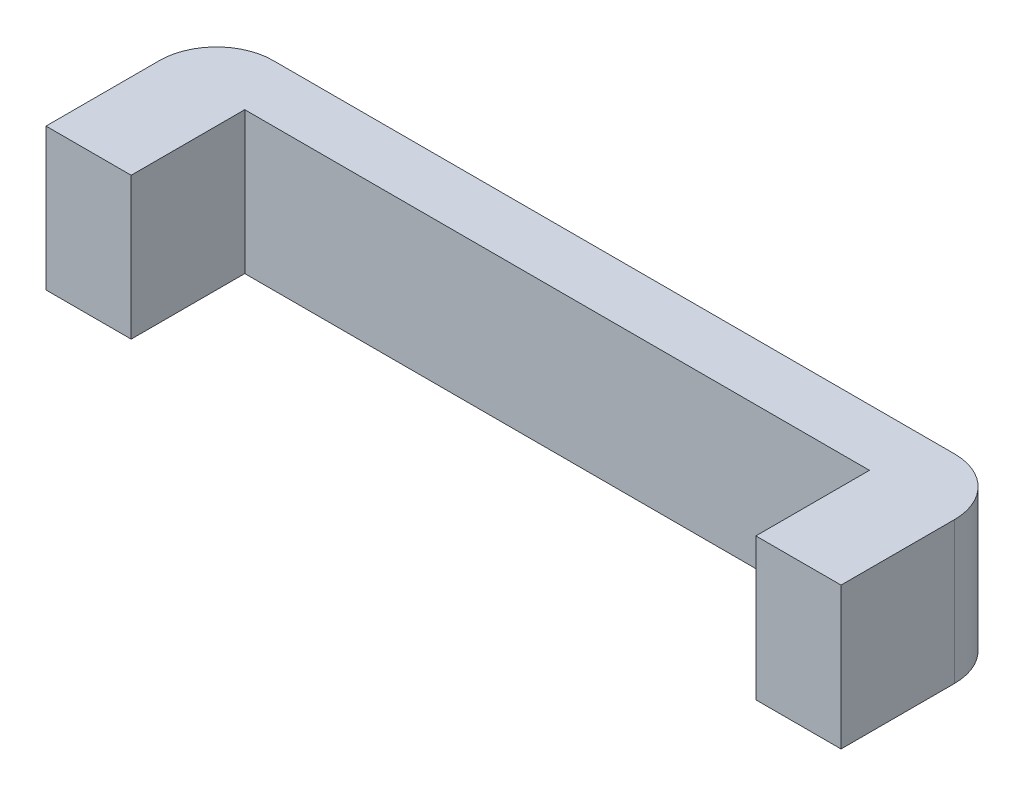
ISO-10303-21;
HEADER;
FILE_DESCRIPTION(('STEP AP214'),'2;1');
FILE_NAME('part.step','',(''),(''),'','','');
FILE_SCHEMA(('AUTOMOTIVE_DESIGN { 1 0 10303 214 1 1 1 1 }'));
ENDSEC;
DATA;
#1=APPLICATION_CONTEXT('core data for automotive mechanical design processes');
#2=APPLICATION_PROTOCOL_DEFINITION('international standard','automotive_design',2000,#1);
#3=PRODUCT_CONTEXT('',#1,'mechanical');
#4=PRODUCT('Part','Part','',(#3));
#5=PRODUCT_RELATED_PRODUCT_CATEGORY('part','',(#4));
#6=PRODUCT_DEFINITION_FORMATION('','',#4);
#7=PRODUCT_DEFINITION_CONTEXT('part definition',#1,'design');
#8=PRODUCT_DEFINITION('design','',#6,#7);
#9=PRODUCT_DEFINITION_SHAPE('','',#8);
#10=(LENGTH_UNIT() NAMED_UNIT(*) SI_UNIT(.MILLI.,.METRE.));
#11=(NAMED_UNIT(*) PLANE_ANGLE_UNIT() SI_UNIT($,.RADIAN.));
#12=(NAMED_UNIT(*) SI_UNIT($,.STERADIAN.) SOLID_ANGLE_UNIT());
#13=UNCERTAINTY_MEASURE_WITH_UNIT(LENGTH_MEASURE(1.E-05),#10,'distance_accuracy_value','');
#14=(GEOMETRIC_REPRESENTATION_CONTEXT(3) GLOBAL_UNCERTAINTY_ASSIGNED_CONTEXT((#13)) GLOBAL_UNIT_ASSIGNED_CONTEXT((#10,
#11,#12)) REPRESENTATION_CONTEXT('',''));
#15=CARTESIAN_POINT('',(0.,0.,0.));
#16=DIRECTION('',(0.,0.,1.));
#17=DIRECTION('',(1.,0.,0.));
#18=AXIS2_PLACEMENT_3D('',#15,#16,#17);
#19=CARTESIAN_POINT('',(0.,6.35,7.62));
#20=DIRECTION('',(0.,0.,-1.));
#21=DIRECTION('',(-1.,0.,0.));
#22=AXIS2_PLACEMENT_3D('',#19,#20,#21);
#23=PLANE('',#22);
#24=DIRECTION('',(1.,0.,0.));
#25=VECTOR('',#24,1.);
#26=CARTESIAN_POINT('',(0.,0.,7.62));
#27=LINE('',#26,#25);
#28=CARTESIAN_POINT('',(0.,0.,7.62));
#29=VERTEX_POINT('',#28);
#30=CARTESIAN_POINT('',(3.81,0.,7.62));
#31=VERTEX_POINT('',#30);
#32=EDGE_CURVE('E130',#29,#31,#27,.T.);
#33=ORIENTED_EDGE('',*,*,#32,.T.);
#34=DIRECTION('',(0.,1.,0.));
#35=VECTOR('',#34,1.);
#36=CARTESIAN_POINT('',(3.81,0.,7.62));
#37=LINE('',#36,#35);
#38=CARTESIAN_POINT('',(3.81,6.35,7.62));
#39=VERTEX_POINT('',#38);
#40=EDGE_CURVE('E112',#31,#39,#37,.T.);
#41=ORIENTED_EDGE('',*,*,#40,.T.);
#42=DIRECTION('',(1.,0.,0.));
#43=VECTOR('',#42,1.);
#44=CARTESIAN_POINT('',(0.,6.35,7.62));
#45=LINE('',#44,#43);
#46=CARTESIAN_POINT('',(0.,6.35,7.62));
#47=VERTEX_POINT('',#46);
#48=EDGE_CURVE('E207',#47,#39,#45,.T.);
#49=ORIENTED_EDGE('',*,*,#48,.F.);
#50=DIRECTION('',(0.,-1.,0.));
#51=VECTOR('',#50,1.);
#52=CARTESIAN_POINT('',(0.,6.35,7.62));
#53=LINE('',#52,#51);
#54=EDGE_CURVE('E137',#47,#29,#53,.T.);
#55=ORIENTED_EDGE('',*,*,#54,.T.);
#56=EDGE_LOOP('',(#33,#41,#49,#55));
#57=FACE_BOUND('',#56,.T.);
#58=ADVANCED_FACE('F33',(#57),#23,.F.);
#59=CARTESIAN_POINT('',(0.,6.35,0.));
#60=DIRECTION('',(1.,0.,0.));
#61=DIRECTION('',(0.,0.,-1.));
#62=AXIS2_PLACEMENT_3D('',#59,#60,#61);
#63=PLANE('',#62);
#64=DIRECTION('',(0.,0.,1.));
#65=VECTOR('',#64,1.);
#66=CARTESIAN_POINT('',(0.,6.35,0.));
#67=LINE('',#66,#65);
#68=CARTESIAN_POINT('',(0.,6.35,2.54));
#69=VERTEX_POINT('',#68);
#70=EDGE_CURVE('E148',#69,#47,#67,.T.);
#71=ORIENTED_EDGE('',*,*,#70,.F.);
#72=DIRECTION('',(0.,-1.,0.));
#73=VECTOR('',#72,1.);
#74=CARTESIAN_POINT('',(0.,6.35,2.54));
#75=LINE('',#74,#73);
#76=CARTESIAN_POINT('',(0.,0.,2.54));
#77=VERTEX_POINT('',#76);
#78=EDGE_CURVE('E154',#69,#77,#75,.T.);
#79=ORIENTED_EDGE('',*,*,#78,.T.);
#80=DIRECTION('',(0.,0.,1.));
#81=VECTOR('',#80,1.);
#82=CARTESIAN_POINT('',(0.,0.,0.));
#83=LINE('',#82,#81);
#84=EDGE_CURVE('E143',#77,#29,#83,.T.);
#85=ORIENTED_EDGE('',*,*,#84,.T.);
#86=ORIENTED_EDGE('',*,*,#54,.F.);
#87=EDGE_LOOP('',(#71,#79,#85,#86));
#88=FACE_BOUND('',#87,.T.);
#89=ADVANCED_FACE('F173',(#88),#63,.F.);
#90=CARTESIAN_POINT('',(31.75,6.35,7.62));
#91=VERTEX_POINT('',#90);
#92=CARTESIAN_POINT('',(35.56,6.35,7.62));
#93=VERTEX_POINT('',#92);
#94=EDGE_CURVE('E174',#91,#93,#45,.T.);
#95=ORIENTED_EDGE('',*,*,#94,.F.);
#96=DIRECTION('',(0.,1.,0.));
#97=VECTOR('',#96,1.);
#98=CARTESIAN_POINT('',(31.75,0.,7.62));
#99=LINE('',#98,#97);
#100=CARTESIAN_POINT('',(31.75,0.,7.62));
#101=VERTEX_POINT('',#100);
#102=EDGE_CURVE('E123',#101,#91,#99,.T.);
#103=ORIENTED_EDGE('',*,*,#102,.F.);
#104=CARTESIAN_POINT('',(35.56,0.,7.62));
#105=VERTEX_POINT('',#104);
#106=EDGE_CURVE('E139',#101,#105,#27,.T.);
#107=ORIENTED_EDGE('',*,*,#106,.T.);
#108=DIRECTION('',(0.,-1.,0.));
#109=VECTOR('',#108,1.);
#110=CARTESIAN_POINT('',(35.56,6.35,7.62));
#111=LINE('',#110,#109);
#112=EDGE_CURVE('E149',#93,#105,#111,.T.);
#113=ORIENTED_EDGE('',*,*,#112,.F.);
#114=EDGE_LOOP('',(#95,#103,#107,#113));
#115=FACE_BOUND('',#114,.T.);
#116=ADVANCED_FACE('F189',(#115),#23,.F.);
#117=CARTESIAN_POINT('',(35.56,6.35,0.));
#118=DIRECTION('',(-1.,0.,0.));
#119=DIRECTION('',(0.,0.,1.));
#120=AXIS2_PLACEMENT_3D('',#117,#118,#119);
#121=PLANE('',#120);
#122=DIRECTION('',(0.,0.,-1.));
#123=VECTOR('',#122,1.);
#124=CARTESIAN_POINT('',(35.56,0.,0.));
#125=LINE('',#124,#123);
#126=CARTESIAN_POINT('',(35.56,0.,2.54));
#127=VERTEX_POINT('',#126);
#128=EDGE_CURVE('E138',#105,#127,#125,.T.);
#129=ORIENTED_EDGE('',*,*,#128,.T.);
#130=DIRECTION('',(0.,-1.,0.));
#131=VECTOR('',#130,1.);
#132=CARTESIAN_POINT('',(35.56,6.35,2.54));
#133=LINE('',#132,#131);
#134=CARTESIAN_POINT('',(35.56,6.35,2.54));
#135=VERTEX_POINT('',#134);
#136=EDGE_CURVE('E11',#127,#135,#133,.F.);
#137=ORIENTED_EDGE('',*,*,#136,.T.);
#138=DIRECTION('',(0.,0.,-1.));
#139=VECTOR('',#138,1.);
#140=CARTESIAN_POINT('',(35.56,6.35,0.));
#141=LINE('',#140,#139);
#142=EDGE_CURVE('E186',#93,#135,#141,.T.);
#143=ORIENTED_EDGE('',*,*,#142,.F.);
#144=ORIENTED_EDGE('',*,*,#112,.T.);
#145=EDGE_LOOP('',(#129,#137,#143,#144));
#146=FACE_BOUND('',#145,.T.);
#147=ADVANCED_FACE('F184',(#146),#121,.F.);
#148=CARTESIAN_POINT('',(0.,6.35,0.));
#149=DIRECTION('',(0.,0.,1.));
#150=DIRECTION('',(1.,0.,0.));
#151=AXIS2_PLACEMENT_3D('',#148,#149,#150);
#152=PLANE('',#151);
#153=DIRECTION('',(-1.,0.,0.));
#154=VECTOR('',#153,1.);
#155=CARTESIAN_POINT('',(0.,0.,0.));
#156=LINE('',#155,#154);
#157=CARTESIAN_POINT('',(33.02,0.,0.));
#158=VERTEX_POINT('',#157);
#159=CARTESIAN_POINT('',(2.54,0.,0.));
#160=VERTEX_POINT('',#159);
#161=EDGE_CURVE('E141',#158,#160,#156,.T.);
#162=ORIENTED_EDGE('',*,*,#161,.T.);
#163=DIRECTION('',(0.,-1.,0.));
#164=VECTOR('',#163,1.);
#165=CARTESIAN_POINT('',(2.54,6.35,0.));
#166=LINE('',#165,#164);
#167=CARTESIAN_POINT('',(2.54,6.35,0.));
#168=VERTEX_POINT('',#167);
#169=EDGE_CURVE('E54',#160,#168,#166,.F.);
#170=ORIENTED_EDGE('',*,*,#169,.T.);
#171=DIRECTION('',(-1.,0.,0.));
#172=VECTOR('',#171,1.);
#173=CARTESIAN_POINT('',(0.,6.35,0.));
#174=LINE('',#173,#172);
#175=CARTESIAN_POINT('',(33.02,6.35,0.));
#176=VERTEX_POINT('',#175);
#177=EDGE_CURVE('E152',#176,#168,#174,.T.);
#178=ORIENTED_EDGE('',*,*,#177,.F.);
#179=DIRECTION('',(0.,-1.,0.));
#180=VECTOR('',#179,1.);
#181=CARTESIAN_POINT('',(33.02,6.35,0.));
#182=LINE('',#181,#180);
#183=EDGE_CURVE('E161',#176,#158,#182,.T.);
#184=ORIENTED_EDGE('',*,*,#183,.T.);
#185=EDGE_LOOP('',(#162,#170,#178,#184));
#186=FACE_BOUND('',#185,.T.);
#187=ADVANCED_FACE('F178',(#186),#152,.F.);
#188=CARTESIAN_POINT('',(0.,6.35,0.));
#189=DIRECTION('',(0.,1.,0.));
#190=DIRECTION('',(0.,0.,1.));
#191=AXIS2_PLACEMENT_3D('',#188,#189,#190);
#192=PLANE('',#191);
#193=ORIENTED_EDGE('',*,*,#177,.T.);
#194=CARTESIAN_POINT('',(2.54,6.35,2.54));
#195=DIRECTION('',(0.,1.,0.));
#196=DIRECTION('',(0.,0.,1.));
#197=AXIS2_PLACEMENT_3D('',#194,#195,#196);
#198=CIRCLE('',#197,2.54);
#199=EDGE_CURVE('E41',#168,#69,#198,.T.);
#200=ORIENTED_EDGE('',*,*,#199,.T.);
#201=ORIENTED_EDGE('',*,*,#70,.T.);
#202=ORIENTED_EDGE('',*,*,#48,.T.);
#203=DIRECTION('',(0.,0.,1.));
#204=VECTOR('',#203,1.);
#205=CARTESIAN_POINT('',(3.81,6.35,7.62));
#206=LINE('',#205,#204);
#207=CARTESIAN_POINT('',(3.81,6.35,2.54));
#208=VERTEX_POINT('',#207);
#209=EDGE_CURVE('E118',#208,#39,#206,.T.);
#210=ORIENTED_EDGE('',*,*,#209,.F.);
#211=DIRECTION('',(-1.,0.,0.));
#212=VECTOR('',#211,1.);
#213=CARTESIAN_POINT('',(3.81,6.35,2.54));
#214=LINE('',#213,#212);
#215=CARTESIAN_POINT('',(31.75,6.35,2.54));
#216=VERTEX_POINT('',#215);
#217=EDGE_CURVE('E134',#216,#208,#214,.T.);
#218=ORIENTED_EDGE('',*,*,#217,.F.);
#219=DIRECTION('',(0.,0.,-1.));
#220=VECTOR('',#219,1.);
#221=CARTESIAN_POINT('',(31.75,6.35,7.62));
#222=LINE('',#221,#220);
#223=EDGE_CURVE('E197',#91,#216,#222,.T.);
#224=ORIENTED_EDGE('',*,*,#223,.F.);
#225=ORIENTED_EDGE('',*,*,#94,.T.);
#226=ORIENTED_EDGE('',*,*,#142,.T.);
#227=CARTESIAN_POINT('',(33.02,6.35,2.54));
#228=DIRECTION('',(0.,1.,0.));
#229=DIRECTION('',(0.,0.,1.));
#230=AXIS2_PLACEMENT_3D('',#227,#228,#229);
#231=CIRCLE('',#230,2.54);
#232=EDGE_CURVE('E165',#135,#176,#231,.T.);
#233=ORIENTED_EDGE('',*,*,#232,.T.);
#234=EDGE_LOOP('',(#193,#200,#201,#202,#210,#218,#224,#225,#226,#233));
#235=FACE_BOUND('',#234,.T.);
#236=ADVANCED_FACE('F169',(#235),#192,.T.);
#237=CARTESIAN_POINT('',(0.,0.,0.));
#238=DIRECTION('',(0.,1.,0.));
#239=DIRECTION('',(0.,0.,1.));
#240=AXIS2_PLACEMENT_3D('',#237,#238,#239);
#241=PLANE('',#240);
#242=ORIENTED_EDGE('',*,*,#84,.F.);
#243=CARTESIAN_POINT('',(2.54,0.,2.54));
#244=DIRECTION('',(0.,1.,0.));
#245=DIRECTION('',(0.,0.,1.));
#246=AXIS2_PLACEMENT_3D('',#243,#244,#245);
#247=CIRCLE('',#246,2.54);
#248=EDGE_CURVE('E159',#77,#160,#247,.F.);
#249=ORIENTED_EDGE('',*,*,#248,.T.);
#250=ORIENTED_EDGE('',*,*,#161,.F.);
#251=CARTESIAN_POINT('',(33.02,0.,2.54));
#252=DIRECTION('',(0.,1.,0.));
#253=DIRECTION('',(0.,0.,1.));
#254=AXIS2_PLACEMENT_3D('',#251,#252,#253);
#255=CIRCLE('',#254,2.54);
#256=EDGE_CURVE('E157',#158,#127,#255,.F.);
#257=ORIENTED_EDGE('',*,*,#256,.T.);
#258=ORIENTED_EDGE('',*,*,#128,.F.);
#259=ORIENTED_EDGE('',*,*,#106,.F.);
#260=DIRECTION('',(0.,0.,-1.));
#261=VECTOR('',#260,1.);
#262=CARTESIAN_POINT('',(31.75,0.,7.62));
#263=LINE('',#262,#261);
#264=CARTESIAN_POINT('',(31.75,0.,2.54));
#265=VERTEX_POINT('',#264);
#266=EDGE_CURVE('E133',#101,#265,#263,.T.);
#267=ORIENTED_EDGE('',*,*,#266,.T.);
#268=DIRECTION('',(-1.,0.,0.));
#269=VECTOR('',#268,1.);
#270=CARTESIAN_POINT('',(3.81,0.,2.54));
#271=LINE('',#270,#269);
#272=CARTESIAN_POINT('',(3.81,0.,2.54));
#273=VERTEX_POINT('',#272);
#274=EDGE_CURVE('E124',#265,#273,#271,.T.);
#275=ORIENTED_EDGE('',*,*,#274,.T.);
#276=DIRECTION('',(0.,0.,1.));
#277=VECTOR('',#276,1.);
#278=CARTESIAN_POINT('',(3.81,0.,7.62));
#279=LINE('',#278,#277);
#280=EDGE_CURVE('E115',#273,#31,#279,.T.);
#281=ORIENTED_EDGE('',*,*,#280,.T.);
#282=ORIENTED_EDGE('',*,*,#32,.F.);
#283=EDGE_LOOP('',(#242,#249,#250,#257,#258,#259,#267,#275,#281,#282));
#284=FACE_BOUND('',#283,.T.);
#285=ADVANCED_FACE('F129',(#284),#241,.F.);
#286=CARTESIAN_POINT('',(3.81,0.,7.62));
#287=DIRECTION('',(-1.,0.,0.));
#288=DIRECTION('',(0.,0.,1.));
#289=AXIS2_PLACEMENT_3D('',#286,#287,#288);
#290=PLANE('',#289);
#291=ORIENTED_EDGE('',*,*,#209,.T.);
#292=ORIENTED_EDGE('',*,*,#40,.F.);
#293=ORIENTED_EDGE('',*,*,#280,.F.);
#294=DIRECTION('',(0.,1.,0.));
#295=VECTOR('',#294,1.);
#296=CARTESIAN_POINT('',(3.81,0.,2.54));
#297=LINE('',#296,#295);
#298=EDGE_CURVE('E202',#273,#208,#297,.T.);
#299=ORIENTED_EDGE('',*,*,#298,.T.);
#300=EDGE_LOOP('',(#291,#292,#293,#299));
#301=FACE_BOUND('',#300,.T.);
#302=ADVANCED_FACE('F114',(#301),#290,.F.);
#303=CARTESIAN_POINT('',(3.81,0.,2.54));
#304=DIRECTION('',(0.,0.,-1.));
#305=DIRECTION('',(-1.,0.,0.));
#306=AXIS2_PLACEMENT_3D('',#303,#304,#305);
#307=PLANE('',#306);
#308=ORIENTED_EDGE('',*,*,#217,.T.);
#309=ORIENTED_EDGE('',*,*,#298,.F.);
#310=ORIENTED_EDGE('',*,*,#274,.F.);
#311=DIRECTION('',(0.,1.,0.));
#312=VECTOR('',#311,1.);
#313=CARTESIAN_POINT('',(31.75,0.,2.54));
#314=LINE('',#313,#312);
#315=EDGE_CURVE('E204',#265,#216,#314,.T.);
#316=ORIENTED_EDGE('',*,*,#315,.T.);
#317=EDGE_LOOP('',(#308,#309,#310,#316));
#318=FACE_BOUND('',#317,.T.);
#319=ADVANCED_FACE('F213',(#318),#307,.F.);
#320=CARTESIAN_POINT('',(31.75,0.,7.62));
#321=DIRECTION('',(1.,0.,0.));
#322=DIRECTION('',(0.,0.,-1.));
#323=AXIS2_PLACEMENT_3D('',#320,#321,#322);
#324=PLANE('',#323);
#325=ORIENTED_EDGE('',*,*,#223,.T.);
#326=ORIENTED_EDGE('',*,*,#315,.F.);
#327=ORIENTED_EDGE('',*,*,#266,.F.);
#328=ORIENTED_EDGE('',*,*,#102,.T.);
#329=EDGE_LOOP('',(#325,#326,#327,#328));
#330=FACE_BOUND('',#329,.T.);
#331=ADVANCED_FACE('F211',(#330),#324,.F.);
#332=CARTESIAN_POINT('',(2.54,6.35,2.54));
#333=DIRECTION('',(0.,-1.,0.));
#334=DIRECTION('',(0.,0.,-1.));
#335=AXIS2_PLACEMENT_3D('',#332,#333,#334);
#336=CYLINDRICAL_SURFACE('',#335,2.54);
#337=ORIENTED_EDGE('',*,*,#199,.F.);
#338=ORIENTED_EDGE('',*,*,#169,.F.);
#339=ORIENTED_EDGE('',*,*,#248,.F.);
#340=ORIENTED_EDGE('',*,*,#78,.F.);
#341=EDGE_LOOP('',(#337,#338,#339,#340));
#342=FACE_BOUND('',#341,.T.);
#343=ADVANCED_FACE('F176',(#342),#336,.T.);
#344=CARTESIAN_POINT('',(33.02,6.35,2.54));
#345=DIRECTION('',(0.,-1.,0.));
#346=DIRECTION('',(0.,0.,-1.));
#347=AXIS2_PLACEMENT_3D('',#344,#345,#346);
#348=CYLINDRICAL_SURFACE('',#347,2.54);
#349=ORIENTED_EDGE('',*,*,#232,.F.);
#350=ORIENTED_EDGE('',*,*,#136,.F.);
#351=ORIENTED_EDGE('',*,*,#256,.F.);
#352=ORIENTED_EDGE('',*,*,#183,.F.);
#353=EDGE_LOOP('',(#349,#350,#351,#352));
#354=FACE_BOUND('',#353,.T.);
#355=ADVANCED_FACE('F35',(#354),#348,.T.);
#356=CLOSED_SHELL('',(#58,#89,#116,#147,#187,#236,#285,#302,#319,#331,#343,#355));
#357=MANIFOLD_SOLID_BREP('B2',#356);
#358=ADVANCED_BREP_SHAPE_REPRESENTATION('',(#18,#357),#14);
#359=SHAPE_DEFINITION_REPRESENTATION(#9,#358);
ENDSEC;
END-ISO-10303-21;
